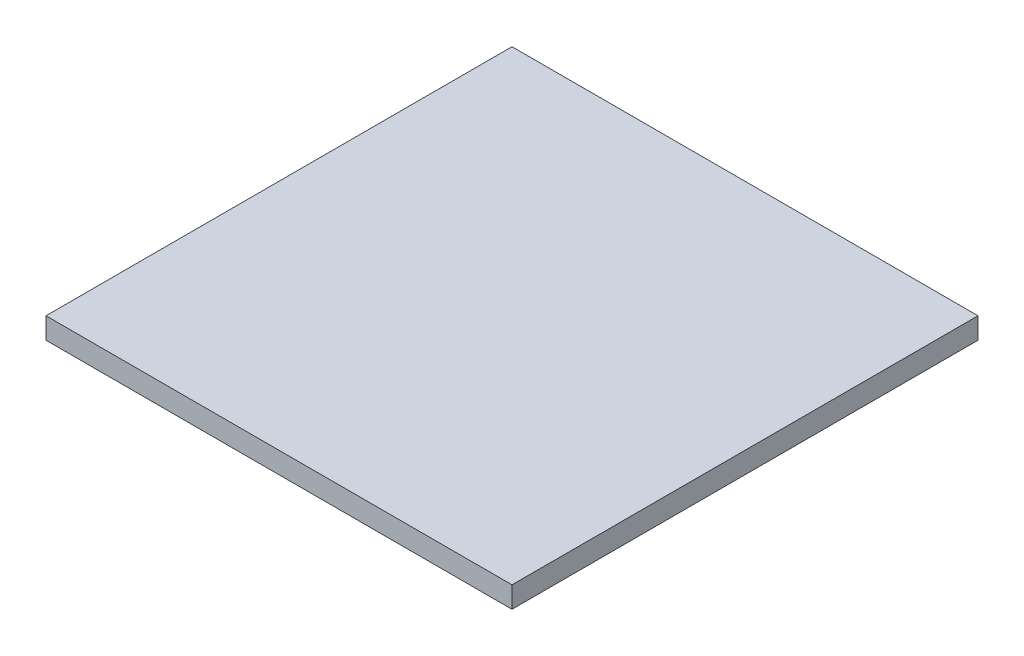
ISO-10303-21;
HEADER;
FILE_DESCRIPTION(('STEP AP214'),'2;1');
FILE_NAME('part.step','',(''),(''),'','','');
FILE_SCHEMA(('AUTOMOTIVE_DESIGN { 1 0 10303 214 1 1 1 1 }'));
ENDSEC;
DATA;
#1=APPLICATION_CONTEXT('core data for automotive mechanical design processes');
#2=APPLICATION_PROTOCOL_DEFINITION('international standard','automotive_design',2000,#1);
#3=PRODUCT_CONTEXT('',#1,'mechanical');
#4=PRODUCT('Part','Part','',(#3));
#5=PRODUCT_RELATED_PRODUCT_CATEGORY('part','',(#4));
#6=PRODUCT_DEFINITION_FORMATION('','',#4);
#7=PRODUCT_DEFINITION_CONTEXT('part definition',#1,'design');
#8=PRODUCT_DEFINITION('design','',#6,#7);
#9=PRODUCT_DEFINITION_SHAPE('','',#8);
#10=(LENGTH_UNIT() NAMED_UNIT(*) SI_UNIT(.MILLI.,.METRE.));
#11=(NAMED_UNIT(*) PLANE_ANGLE_UNIT() SI_UNIT($,.RADIAN.));
#12=(NAMED_UNIT(*) SI_UNIT($,.STERADIAN.) SOLID_ANGLE_UNIT());
#13=UNCERTAINTY_MEASURE_WITH_UNIT(LENGTH_MEASURE(1.E-05),#10,'distance_accuracy_value','');
#14=(GEOMETRIC_REPRESENTATION_CONTEXT(3) GLOBAL_UNCERTAINTY_ASSIGNED_CONTEXT((#13)) GLOBAL_UNIT_ASSIGNED_CONTEXT((#10,
#11,#12)) REPRESENTATION_CONTEXT('',''));
#15=CARTESIAN_POINT('',(0.,0.,0.));
#16=DIRECTION('',(0.,0.,1.));
#17=DIRECTION('',(1.,0.,0.));
#18=AXIS2_PLACEMENT_3D('',#15,#16,#17);
#19=CARTESIAN_POINT('',(0.,0.455,0.));
#20=DIRECTION('',(1.,0.,0.));
#21=DIRECTION('',(0.,0.,-1.));
#22=AXIS2_PLACEMENT_3D('',#19,#20,#21);
#23=PLANE('',#22);
#24=DIRECTION('',(0.,0.,1.));
#25=VECTOR('',#24,1.);
#26=CARTESIAN_POINT('',(0.,0.,0.));
#27=LINE('',#26,#25);
#28=CARTESIAN_POINT('',(0.,0.,-9.99999999999999));
#29=VERTEX_POINT('',#28);
#30=CARTESIAN_POINT('',(0.,0.,0.));
#31=VERTEX_POINT('',#30);
#32=EDGE_CURVE('E100',#29,#31,#27,.T.);
#33=ORIENTED_EDGE('',*,*,#32,.T.);
#34=DIRECTION('',(0.,-1.,0.));
#35=VECTOR('',#34,1.);
#36=CARTESIAN_POINT('',(0.,0.455,0.));
#37=LINE('',#36,#35);
#38=CARTESIAN_POINT('',(0.,0.455,0.));
#39=VERTEX_POINT('',#38);
#40=EDGE_CURVE('E11',#39,#31,#37,.T.);
#41=ORIENTED_EDGE('',*,*,#40,.F.);
#42=DIRECTION('',(0.,0.,1.));
#43=VECTOR('',#42,1.);
#44=CARTESIAN_POINT('',(0.,0.455,0.));
#45=LINE('',#44,#43);
#46=CARTESIAN_POINT('',(0.,0.455,-9.99999999999999));
#47=VERTEX_POINT('',#46);
#48=EDGE_CURVE('E88',#47,#39,#45,.T.);
#49=ORIENTED_EDGE('',*,*,#48,.F.);
#50=DIRECTION('',(0.,-1.,0.));
#51=VECTOR('',#50,1.);
#52=CARTESIAN_POINT('',(0.,0.455,-9.99999999999999));
#53=LINE('',#52,#51);
#54=EDGE_CURVE('E96',#47,#29,#53,.T.);
#55=ORIENTED_EDGE('',*,*,#54,.T.);
#56=EDGE_LOOP('',(#33,#41,#49,#55));
#57=FACE_BOUND('',#56,.T.);
#58=ADVANCED_FACE('F37',(#57),#23,.F.);
#59=CARTESIAN_POINT('',(0.,0.455,0.));
#60=DIRECTION('',(0.,0.,-1.));
#61=DIRECTION('',(-1.,0.,0.));
#62=AXIS2_PLACEMENT_3D('',#59,#60,#61);
#63=PLANE('',#62);
#64=DIRECTION('',(1.,0.,0.));
#65=VECTOR('',#64,1.);
#66=CARTESIAN_POINT('',(0.,0.,0.));
#67=LINE('',#66,#65);
#68=CARTESIAN_POINT('',(9.99999999999999,0.,0.));
#69=VERTEX_POINT('',#68);
#70=EDGE_CURVE('E92',#31,#69,#67,.T.);
#71=ORIENTED_EDGE('',*,*,#70,.T.);
#72=DIRECTION('',(0.,-1.,0.));
#73=VECTOR('',#72,1.);
#74=CARTESIAN_POINT('',(9.99999999999999,0.455,0.));
#75=LINE('',#74,#73);
#76=CARTESIAN_POINT('',(9.99999999999999,0.455,0.));
#77=VERTEX_POINT('',#76);
#78=EDGE_CURVE('E45',#77,#69,#75,.T.);
#79=ORIENTED_EDGE('',*,*,#78,.F.);
#80=DIRECTION('',(1.,0.,0.));
#81=VECTOR('',#80,1.);
#82=CARTESIAN_POINT('',(0.,0.455,0.));
#83=LINE('',#82,#81);
#84=EDGE_CURVE('E83',#39,#77,#83,.T.);
#85=ORIENTED_EDGE('',*,*,#84,.F.);
#86=ORIENTED_EDGE('',*,*,#40,.T.);
#87=EDGE_LOOP('',(#71,#79,#85,#86));
#88=FACE_BOUND('',#87,.T.);
#89=ADVANCED_FACE('F91',(#88),#63,.F.);
#90=CARTESIAN_POINT('',(9.99999999999999,0.455,0.));
#91=DIRECTION('',(-1.,0.,0.));
#92=DIRECTION('',(0.,0.,1.));
#93=AXIS2_PLACEMENT_3D('',#90,#91,#92);
#94=PLANE('',#93);
#95=DIRECTION('',(0.,0.,-1.));
#96=VECTOR('',#95,1.);
#97=CARTESIAN_POINT('',(9.99999999999999,0.,0.));
#98=LINE('',#97,#96);
#99=CARTESIAN_POINT('',(9.99999999999999,0.,-9.99999999999999));
#100=VERTEX_POINT('',#99);
#101=EDGE_CURVE('E70',#69,#100,#98,.T.);
#102=ORIENTED_EDGE('',*,*,#101,.T.);
#103=DIRECTION('',(0.,-1.,0.));
#104=VECTOR('',#103,1.);
#105=CARTESIAN_POINT('',(9.99999999999999,0.455,-9.99999999999999));
#106=LINE('',#105,#104);
#107=CARTESIAN_POINT('',(9.99999999999999,0.455,-9.99999999999999));
#108=VERTEX_POINT('',#107);
#109=EDGE_CURVE('E93',#108,#100,#106,.T.);
#110=ORIENTED_EDGE('',*,*,#109,.F.);
#111=DIRECTION('',(0.,0.,-1.));
#112=VECTOR('',#111,1.);
#113=CARTESIAN_POINT('',(9.99999999999999,0.455,0.));
#114=LINE('',#113,#112);
#115=EDGE_CURVE('E86',#77,#108,#114,.T.);
#116=ORIENTED_EDGE('',*,*,#115,.F.);
#117=ORIENTED_EDGE('',*,*,#78,.T.);
#118=EDGE_LOOP('',(#102,#110,#116,#117));
#119=FACE_BOUND('',#118,.T.);
#120=ADVANCED_FACE('F94',(#119),#94,.F.);
#121=CARTESIAN_POINT('',(0.,0.455,-9.99999999999999));
#122=DIRECTION('',(0.,0.,1.));
#123=DIRECTION('',(1.,0.,0.));
#124=AXIS2_PLACEMENT_3D('',#121,#122,#123);
#125=PLANE('',#124);
#126=DIRECTION('',(-1.,0.,0.));
#127=VECTOR('',#126,1.);
#128=CARTESIAN_POINT('',(0.,0.,-9.99999999999999));
#129=LINE('',#128,#127);
#130=EDGE_CURVE('E76',#100,#29,#129,.T.);
#131=ORIENTED_EDGE('',*,*,#130,.T.);
#132=ORIENTED_EDGE('',*,*,#54,.F.);
#133=DIRECTION('',(-1.,0.,0.));
#134=VECTOR('',#133,1.);
#135=CARTESIAN_POINT('',(0.,0.455,-9.99999999999999));
#136=LINE('',#135,#134);
#137=EDGE_CURVE('E53',#108,#47,#136,.T.);
#138=ORIENTED_EDGE('',*,*,#137,.F.);
#139=ORIENTED_EDGE('',*,*,#109,.T.);
#140=EDGE_LOOP('',(#131,#132,#138,#139));
#141=FACE_BOUND('',#140,.T.);
#142=ADVANCED_FACE('F107',(#141),#125,.F.);
#143=CARTESIAN_POINT('',(0.,0.455,0.));
#144=DIRECTION('',(0.,-1.,0.));
#145=DIRECTION('',(0.,0.,-1.));
#146=AXIS2_PLACEMENT_3D('',#143,#144,#145);
#147=PLANE('',#146);
#148=ORIENTED_EDGE('',*,*,#48,.T.);
#149=ORIENTED_EDGE('',*,*,#84,.T.);
#150=ORIENTED_EDGE('',*,*,#115,.T.);
#151=ORIENTED_EDGE('',*,*,#137,.T.);
#152=EDGE_LOOP('',(#148,#149,#150,#151));
#153=FACE_BOUND('',#152,.T.);
#154=ADVANCED_FACE('F84',(#153),#147,.F.);
#155=CARTESIAN_POINT('',(0.,0.,0.));
#156=DIRECTION('',(0.,-1.,0.));
#157=DIRECTION('',(0.,0.,-1.));
#158=AXIS2_PLACEMENT_3D('',#155,#156,#157);
#159=PLANE('',#158);
#160=ORIENTED_EDGE('',*,*,#32,.F.);
#161=ORIENTED_EDGE('',*,*,#130,.F.);
#162=ORIENTED_EDGE('',*,*,#101,.F.);
#163=ORIENTED_EDGE('',*,*,#70,.F.);
#164=EDGE_LOOP('',(#160,#161,#162,#163));
#165=FACE_BOUND('',#164,.T.);
#166=ADVANCED_FACE('F110',(#165),#159,.T.);
#167=CLOSED_SHELL('',(#58,#89,#120,#142,#154,#166));
#168=MANIFOLD_SOLID_BREP('B2',#167);
#169=ADVANCED_BREP_SHAPE_REPRESENTATION('',(#18,#168),#14);
#170=SHAPE_DEFINITION_REPRESENTATION(#9,#169);
ENDSEC;
END-ISO-10303-21;
